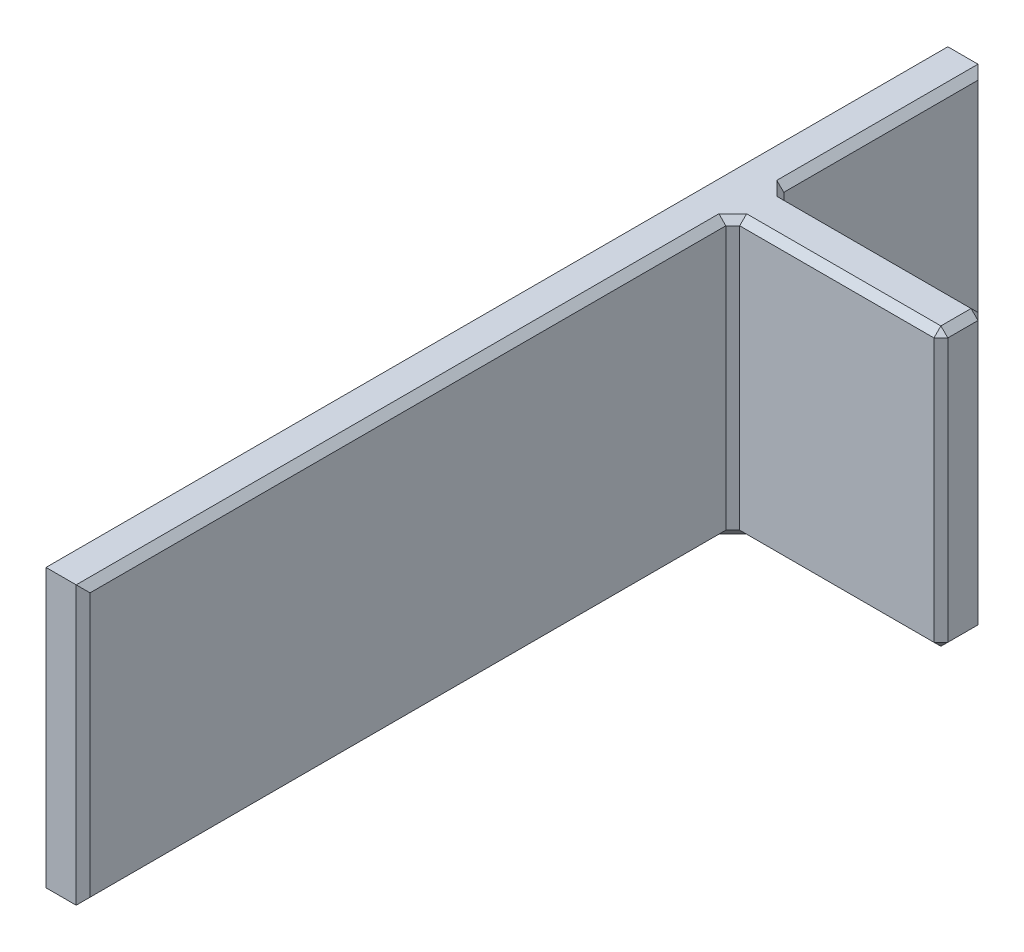
ISO-10303-21;
HEADER;
FILE_DESCRIPTION(('STEP AP214'),'2;1');
FILE_NAME('part.step','',(''),(''),'','','');
FILE_SCHEMA(('AUTOMOTIVE_DESIGN { 1 0 10303 214 1 1 1 1 }'));
ENDSEC;
DATA;
#1=APPLICATION_CONTEXT('core data for automotive mechanical design processes');
#2=APPLICATION_PROTOCOL_DEFINITION('international standard','automotive_design',2000,#1);
#3=PRODUCT_CONTEXT('',#1,'mechanical');
#4=PRODUCT('Part','Part','',(#3));
#5=PRODUCT_RELATED_PRODUCT_CATEGORY('part','',(#4));
#6=PRODUCT_DEFINITION_FORMATION('','',#4);
#7=PRODUCT_DEFINITION_CONTEXT('part definition',#1,'design');
#8=PRODUCT_DEFINITION('design','',#6,#7);
#9=PRODUCT_DEFINITION_SHAPE('','',#8);
#10=(LENGTH_UNIT() NAMED_UNIT(*) SI_UNIT(.MILLI.,.METRE.));
#11=(NAMED_UNIT(*) PLANE_ANGLE_UNIT() SI_UNIT($,.RADIAN.));
#12=(NAMED_UNIT(*) SI_UNIT($,.STERADIAN.) SOLID_ANGLE_UNIT());
#13=UNCERTAINTY_MEASURE_WITH_UNIT(LENGTH_MEASURE(1.E-05),#10,'distance_accuracy_value','');
#14=(GEOMETRIC_REPRESENTATION_CONTEXT(3) GLOBAL_UNCERTAINTY_ASSIGNED_CONTEXT((#13)) GLOBAL_UNIT_ASSIGNED_CONTEXT((#10,
#11,#12)) REPRESENTATION_CONTEXT('',''));
#15=CARTESIAN_POINT('',(0.,0.,0.));
#16=DIRECTION('',(0.,0.,1.));
#17=DIRECTION('',(1.,0.,0.));
#18=AXIS2_PLACEMENT_3D('',#15,#16,#17);
#19=CARTESIAN_POINT('',(3.175,-20.,130.));
#20=DIRECTION('',(0.,1.,0.));
#21=DIRECTION('',(0.,0.,1.));
#22=AXIS2_PLACEMENT_3D('',#19,#20,#21);
#23=PLANE('',#22);
#24=DIRECTION('',(1.,0.,0.));
#25=VECTOR('',#24,1.);
#26=CARTESIAN_POINT('',(3.175,-20.,0.));
#27=LINE('',#26,#25);
#28=CARTESIAN_POINT('',(-2.175,-20.,0.));
#29=VERTEX_POINT('',#28);
#30=CARTESIAN_POINT('',(2.17499999999999,-20.,0.));
#31=VERTEX_POINT('',#30);
#32=EDGE_CURVE('E425',#29,#31,#27,.T.);
#33=ORIENTED_EDGE('',*,*,#32,.T.);
#34=DIRECTION('',(0.,0.,1.));
#35=VECTOR('',#34,1.);
#36=CARTESIAN_POINT('',(2.17499999999999,-20.,130.));
#37=LINE('',#36,#35);
#38=CARTESIAN_POINT('',(2.17499999999999,-20.,29.));
#39=VERTEX_POINT('',#38);
#40=EDGE_CURVE('E247',#31,#39,#37,.T.);
#41=ORIENTED_EDGE('',*,*,#40,.T.);
#42=DIRECTION('',(-0.707106781186554,0.,-0.707106781186541));
#43=VECTOR('',#42,1.);
#44=CARTESIAN_POINT('',(2.17499999999999,-20.,29.));
#45=LINE('',#44,#43);
#46=CARTESIAN_POINT('',(3.175,-20.,30.));
#47=VERTEX_POINT('',#46);
#48=EDGE_CURVE('E243',#47,#39,#45,.T.);
#49=ORIENTED_EDGE('',*,*,#48,.F.);
#50=DIRECTION('',(-0.707106781186554,0.,-0.707106781186541));
#51=VECTOR('',#50,1.);
#52=CARTESIAN_POINT('',(2.17499999999999,-20.,29.));
#53=LINE('',#52,#51);
#54=CARTESIAN_POINT('',(4.17500000000002,-20.,31.));
#55=VERTEX_POINT('',#54);
#56=EDGE_CURVE('E239',#55,#47,#53,.T.);
#57=ORIENTED_EDGE('',*,*,#56,.F.);
#58=DIRECTION('',(1.,0.,0.));
#59=VECTOR('',#58,1.);
#60=CARTESIAN_POINT('',(3.175,-20.,31.));
#61=LINE('',#60,#59);
#62=CARTESIAN_POINT('',(32.175,-20.,31.));
#63=VERTEX_POINT('',#62);
#64=EDGE_CURVE('E236',#55,#63,#61,.T.);
#65=ORIENTED_EDGE('',*,*,#64,.T.);
#66=DIRECTION('',(0.,0.,1.));
#67=VECTOR('',#66,1.);
#68=CARTESIAN_POINT('',(32.175,-20.,130.));
#69=LINE('',#68,#67);
#70=CARTESIAN_POINT('',(32.175,-20.,35.35));
#71=VERTEX_POINT('',#70);
#72=EDGE_CURVE('E233',#63,#71,#69,.T.);
#73=ORIENTED_EDGE('',*,*,#72,.T.);
#74=DIRECTION('',(-1.,0.,0.));
#75=VECTOR('',#74,1.);
#76=CARTESIAN_POINT('',(3.175,-20.,35.35));
#77=LINE('',#76,#75);
#78=CARTESIAN_POINT('',(4.17500000000002,-20.,35.35));
#79=VERTEX_POINT('',#78);
#80=EDGE_CURVE('E212',#71,#79,#77,.T.);
#81=ORIENTED_EDGE('',*,*,#80,.T.);
#82=DIRECTION('',(0.707106781186553,0.,-0.707106781186542));
#83=VECTOR('',#82,1.);
#84=CARTESIAN_POINT('',(4.17500000000002,-20.,35.35));
#85=LINE('',#84,#83);
#86=CARTESIAN_POINT('',(3.175,-20.,36.35));
#87=VERTEX_POINT('',#86);
#88=EDGE_CURVE('E206',#87,#79,#85,.T.);
#89=ORIENTED_EDGE('',*,*,#88,.F.);
#90=DIRECTION('',(0.707106781186553,0.,-0.707106781186542));
#91=VECTOR('',#90,1.);
#92=CARTESIAN_POINT('',(4.17500000000002,-20.,35.35));
#93=LINE('',#92,#91);
#94=CARTESIAN_POINT('',(2.17499999999999,-20.,37.35));
#95=VERTEX_POINT('',#94);
#96=EDGE_CURVE('E209',#95,#87,#93,.T.);
#97=ORIENTED_EDGE('',*,*,#96,.F.);
#98=DIRECTION('',(0.,0.,1.));
#99=VECTOR('',#98,1.);
#100=CARTESIAN_POINT('',(2.17499999999999,-20.,130.));
#101=LINE('',#100,#99);
#102=CARTESIAN_POINT('',(2.17499999999999,-20.,130.));
#103=VERTEX_POINT('',#102);
#104=EDGE_CURVE('E224',#95,#103,#101,.T.);
#105=ORIENTED_EDGE('',*,*,#104,.T.);
#106=DIRECTION('',(1.,0.,0.));
#107=VECTOR('',#106,1.);
#108=CARTESIAN_POINT('',(3.175,-20.,130.));
#109=LINE('',#108,#107);
#110=CARTESIAN_POINT('',(-2.175,-20.,130.));
#111=VERTEX_POINT('',#110);
#112=EDGE_CURVE('E503',#111,#103,#109,.T.);
#113=ORIENTED_EDGE('',*,*,#112,.F.);
#114=DIRECTION('',(0.,0.,-1.));
#115=VECTOR('',#114,1.);
#116=CARTESIAN_POINT('',(-2.175,-20.,130.));
#117=LINE('',#116,#115);
#118=EDGE_CURVE('E227',#111,#29,#117,.T.);
#119=ORIENTED_EDGE('',*,*,#118,.T.);
#120=EDGE_LOOP('',(#33,#41,#49,#57,#65,#73,#81,#89,#97,#105,#113,#119));
#121=FACE_BOUND('',#120,.T.);
#122=ADVANCED_FACE('F44',(#121),#23,.F.);
#123=CARTESIAN_POINT('',(3.175,20.,130.));
#124=DIRECTION('',(0.,-1.,0.));
#125=DIRECTION('',(0.,0.,-1.));
#126=AXIS2_PLACEMENT_3D('',#123,#124,#125);
#127=PLANE('',#126);
#128=DIRECTION('',(0.707106781186554,0.,0.707106781186541));
#129=VECTOR('',#128,1.);
#130=CARTESIAN_POINT('',(4.17500000000001,20.,31.));
#131=LINE('',#130,#129);
#132=CARTESIAN_POINT('',(2.17499999999999,20.,29.));
#133=VERTEX_POINT('',#132);
#134=CARTESIAN_POINT('',(3.175,20.,30.));
#135=VERTEX_POINT('',#134);
#136=EDGE_CURVE('E466',#133,#135,#131,.T.);
#137=ORIENTED_EDGE('',*,*,#136,.F.);
#138=DIRECTION('',(0.,0.,-1.));
#139=VECTOR('',#138,1.);
#140=CARTESIAN_POINT('',(2.17499999999999,20.,130.));
#141=LINE('',#140,#139);
#142=CARTESIAN_POINT('',(2.17499999999999,20.,0.));
#143=VERTEX_POINT('',#142);
#144=EDGE_CURVE('E463',#133,#143,#141,.T.);
#145=ORIENTED_EDGE('',*,*,#144,.T.);
#146=DIRECTION('',(-1.,0.,0.));
#147=VECTOR('',#146,1.);
#148=CARTESIAN_POINT('',(3.175,20.,0.));
#149=LINE('',#148,#147);
#150=CARTESIAN_POINT('',(-2.175,20.,0.));
#151=VERTEX_POINT('',#150);
#152=EDGE_CURVE('E499',#143,#151,#149,.T.);
#153=ORIENTED_EDGE('',*,*,#152,.T.);
#154=DIRECTION('',(0.,0.,1.));
#155=VECTOR('',#154,1.);
#156=CARTESIAN_POINT('',(-2.175,20.,130.));
#157=LINE('',#156,#155);
#158=CARTESIAN_POINT('',(-2.175,20.,130.));
#159=VERTEX_POINT('',#158);
#160=EDGE_CURVE('E495',#151,#159,#157,.T.);
#161=ORIENTED_EDGE('',*,*,#160,.T.);
#162=DIRECTION('',(-1.,0.,0.));
#163=VECTOR('',#162,1.);
#164=CARTESIAN_POINT('',(3.175,20.,130.));
#165=LINE('',#164,#163);
#166=CARTESIAN_POINT('',(2.17499999999999,20.,130.));
#167=VERTEX_POINT('',#166);
#168=EDGE_CURVE('E498',#167,#159,#165,.T.);
#169=ORIENTED_EDGE('',*,*,#168,.F.);
#170=DIRECTION('',(0.,0.,-1.));
#171=VECTOR('',#170,1.);
#172=CARTESIAN_POINT('',(2.17499999999999,20.,130.));
#173=LINE('',#172,#171);
#174=CARTESIAN_POINT('',(2.17499999999999,20.,37.35));
#175=VERTEX_POINT('',#174);
#176=EDGE_CURVE('E484',#167,#175,#173,.T.);
#177=ORIENTED_EDGE('',*,*,#176,.T.);
#178=DIRECTION('',(-0.707106781186553,0.,0.707106781186542));
#179=VECTOR('',#178,1.);
#180=CARTESIAN_POINT('',(2.17499999999999,20.,37.35));
#181=LINE('',#180,#179);
#182=CARTESIAN_POINT('',(3.175,20.,36.35));
#183=VERTEX_POINT('',#182);
#184=EDGE_CURVE('E491',#183,#175,#181,.T.);
#185=ORIENTED_EDGE('',*,*,#184,.F.);
#186=DIRECTION('',(-0.707106781186553,0.,0.707106781186542));
#187=VECTOR('',#186,1.);
#188=CARTESIAN_POINT('',(2.17499999999999,20.,37.35));
#189=LINE('',#188,#187);
#190=CARTESIAN_POINT('',(4.17500000000002,20.,35.35));
#191=VERTEX_POINT('',#190);
#192=EDGE_CURVE('E487',#191,#183,#189,.T.);
#193=ORIENTED_EDGE('',*,*,#192,.F.);
#194=DIRECTION('',(1.,0.,0.));
#195=VECTOR('',#194,1.);
#196=CARTESIAN_POINT('',(3.175,20.,35.35));
#197=LINE('',#196,#195);
#198=CARTESIAN_POINT('',(32.175,20.,35.35));
#199=VERTEX_POINT('',#198);
#200=EDGE_CURVE('E481',#191,#199,#197,.T.);
#201=ORIENTED_EDGE('',*,*,#200,.T.);
#202=DIRECTION('',(0.,0.,-1.));
#203=VECTOR('',#202,1.);
#204=CARTESIAN_POINT('',(32.175,20.,130.));
#205=LINE('',#204,#203);
#206=CARTESIAN_POINT('',(32.175,20.,31.));
#207=VERTEX_POINT('',#206);
#208=EDGE_CURVE('E478',#199,#207,#205,.T.);
#209=ORIENTED_EDGE('',*,*,#208,.T.);
#210=DIRECTION('',(-1.,0.,0.));
#211=VECTOR('',#210,1.);
#212=CARTESIAN_POINT('',(3.175,20.,31.));
#213=LINE('',#212,#211);
#214=CARTESIAN_POINT('',(4.17500000000002,20.,31.));
#215=VERTEX_POINT('',#214);
#216=EDGE_CURVE('E474',#207,#215,#213,.T.);
#217=ORIENTED_EDGE('',*,*,#216,.T.);
#218=DIRECTION('',(0.707106781186554,0.,0.707106781186541));
#219=VECTOR('',#218,1.);
#220=CARTESIAN_POINT('',(4.17500000000001,20.,31.));
#221=LINE('',#220,#219);
#222=EDGE_CURVE('E470',#135,#215,#221,.T.);
#223=ORIENTED_EDGE('',*,*,#222,.F.);
#224=EDGE_LOOP('',(#137,#145,#153,#161,#169,#177,#185,#193,#201,#209,#217,#223));
#225=FACE_BOUND('',#224,.T.);
#226=ADVANCED_FACE('F529',(#225),#127,.F.);
#227=CARTESIAN_POINT('',(3.175,-20.,130.));
#228=DIRECTION('',(-1.,0.,0.));
#229=DIRECTION('',(0.,0.,1.));
#230=AXIS2_PLACEMENT_3D('',#227,#228,#229);
#231=PLANE('',#230);
#232=DIRECTION('',(0.,1.,0.));
#233=VECTOR('',#232,1.);
#234=CARTESIAN_POINT('',(3.175,-20.,1.));
#235=LINE('',#234,#233);
#236=CARTESIAN_POINT('',(3.175,-19.,1.));
#237=VERTEX_POINT('',#236);
#238=CARTESIAN_POINT('',(3.175,19.,1.));
#239=VERTEX_POINT('',#238);
#240=EDGE_CURVE('E256',#237,#239,#235,.T.);
#241=ORIENTED_EDGE('',*,*,#240,.T.);
#242=DIRECTION('',(0.,0.,1.));
#243=VECTOR('',#242,1.);
#244=CARTESIAN_POINT('',(3.175,19.,130.));
#245=LINE('',#244,#243);
#246=CARTESIAN_POINT('',(3.175,19.,29.));
#247=VERTEX_POINT('',#246);
#248=EDGE_CURVE('E259',#239,#247,#245,.T.);
#249=ORIENTED_EDGE('',*,*,#248,.T.);
#250=DIRECTION('',(0.,-1.,0.));
#251=VECTOR('',#250,1.);
#252=CARTESIAN_POINT('',(3.175,-20.,29.));
#253=LINE('',#252,#251);
#254=CARTESIAN_POINT('',(3.175,-19.,29.));
#255=VERTEX_POINT('',#254);
#256=EDGE_CURVE('E250',#247,#255,#253,.T.);
#257=ORIENTED_EDGE('',*,*,#256,.T.);
#258=DIRECTION('',(0.,0.,-1.));
#259=VECTOR('',#258,1.);
#260=CARTESIAN_POINT('',(3.175,-19.,130.));
#261=LINE('',#260,#259);
#262=EDGE_CURVE('E253',#255,#237,#261,.T.);
#263=ORIENTED_EDGE('',*,*,#262,.T.);
#264=EDGE_LOOP('',(#241,#249,#257,#263));
#265=FACE_BOUND('',#264,.T.);
#266=ADVANCED_FACE('F547',(#265),#231,.F.);
#267=DIRECTION('',(0.,-1.,0.));
#268=VECTOR('',#267,1.);
#269=CARTESIAN_POINT('',(3.175,-20.,129.));
#270=LINE('',#269,#268);
#271=CARTESIAN_POINT('',(3.175,19.,129.));
#272=VERTEX_POINT('',#271);
#273=CARTESIAN_POINT('',(3.175,-19.,129.));
#274=VERTEX_POINT('',#273);
#275=EDGE_CURVE('E301',#272,#274,#270,.T.);
#276=ORIENTED_EDGE('',*,*,#275,.T.);
#277=DIRECTION('',(0.,0.,-1.));
#278=VECTOR('',#277,1.);
#279=CARTESIAN_POINT('',(3.175,-19.,130.));
#280=LINE('',#279,#278);
#281=CARTESIAN_POINT('',(3.175,-19.,37.35));
#282=VERTEX_POINT('',#281);
#283=EDGE_CURVE('E304',#274,#282,#280,.T.);
#284=ORIENTED_EDGE('',*,*,#283,.T.);
#285=DIRECTION('',(0.,1.,0.));
#286=VECTOR('',#285,1.);
#287=CARTESIAN_POINT('',(3.175,20.,37.35));
#288=LINE('',#287,#286);
#289=CARTESIAN_POINT('',(3.175,19.,37.35));
#290=VERTEX_POINT('',#289);
#291=EDGE_CURVE('E295',#282,#290,#288,.T.);
#292=ORIENTED_EDGE('',*,*,#291,.T.);
#293=DIRECTION('',(0.,0.,1.));
#294=VECTOR('',#293,1.);
#295=CARTESIAN_POINT('',(3.175,19.,130.));
#296=LINE('',#295,#294);
#297=EDGE_CURVE('E298',#290,#272,#296,.T.);
#298=ORIENTED_EDGE('',*,*,#297,.T.);
#299=EDGE_LOOP('',(#276,#284,#292,#298));
#300=FACE_BOUND('',#299,.T.);
#301=ADVANCED_FACE('F539',(#300),#231,.F.);
#302=CARTESIAN_POINT('',(-3.175,-20.,130.));
#303=DIRECTION('',(1.,0.,0.));
#304=DIRECTION('',(0.,0.,-1.));
#305=AXIS2_PLACEMENT_3D('',#302,#303,#304);
#306=PLANE('',#305);
#307=DIRECTION('',(0.,1.,0.));
#308=VECTOR('',#307,1.);
#309=CARTESIAN_POINT('',(-3.175,20.,129.));
#310=LINE('',#309,#308);
#311=CARTESIAN_POINT('',(-3.175,-19.,129.));
#312=VERTEX_POINT('',#311);
#313=CARTESIAN_POINT('',(-3.175,19.,129.));
#314=VERTEX_POINT('',#313);
#315=EDGE_CURVE('E55',#312,#314,#310,.T.);
#316=ORIENTED_EDGE('',*,*,#315,.T.);
#317=DIRECTION('',(0.,0.,-1.));
#318=VECTOR('',#317,1.);
#319=CARTESIAN_POINT('',(-3.175,19.,130.));
#320=LINE('',#319,#318);
#321=CARTESIAN_POINT('',(-3.175,19.,1.));
#322=VERTEX_POINT('',#321);
#323=EDGE_CURVE('E11',#314,#322,#320,.T.);
#324=ORIENTED_EDGE('',*,*,#323,.T.);
#325=DIRECTION('',(0.,-1.,0.));
#326=VECTOR('',#325,1.);
#327=CARTESIAN_POINT('',(-3.175,-20.,1.));
#328=LINE('',#327,#326);
#329=CARTESIAN_POINT('',(-3.175,-19.,1.));
#330=VERTEX_POINT('',#329);
#331=EDGE_CURVE('E314',#322,#330,#328,.T.);
#332=ORIENTED_EDGE('',*,*,#331,.T.);
#333=DIRECTION('',(0.,0.,1.));
#334=VECTOR('',#333,1.);
#335=CARTESIAN_POINT('',(-3.175,-19.,130.));
#336=LINE('',#335,#334);
#337=EDGE_CURVE('E66',#330,#312,#336,.T.);
#338=ORIENTED_EDGE('',*,*,#337,.T.);
#339=EDGE_LOOP('',(#316,#324,#332,#338));
#340=FACE_BOUND('',#339,.T.);
#341=ADVANCED_FACE('F537',(#340),#306,.F.);
#342=CARTESIAN_POINT('',(0.,0.,130.));
#343=DIRECTION('',(0.,0.,1.));
#344=DIRECTION('',(1.,0.,0.));
#345=AXIS2_PLACEMENT_3D('',#342,#343,#344);
#346=PLANE('',#345);
#347=ORIENTED_EDGE('',*,*,#112,.T.);
#348=DIRECTION('',(0.,1.,0.));
#349=VECTOR('',#348,1.);
#350=CARTESIAN_POINT('',(2.17499999999999,20.,130.));
#351=LINE('',#350,#349);
#352=EDGE_CURVE('E311',#103,#167,#351,.T.);
#353=ORIENTED_EDGE('',*,*,#352,.T.);
#354=ORIENTED_EDGE('',*,*,#168,.T.);
#355=DIRECTION('',(0.,-1.,0.));
#356=VECTOR('',#355,1.);
#357=CARTESIAN_POINT('',(-2.175,-20.,130.));
#358=LINE('',#357,#356);
#359=EDGE_CURVE('E308',#159,#111,#358,.T.);
#360=ORIENTED_EDGE('',*,*,#359,.T.);
#361=EDGE_LOOP('',(#347,#353,#354,#360));
#362=FACE_BOUND('',#361,.T.);
#363=ADVANCED_FACE('F513',(#362),#346,.T.);
#364=CARTESIAN_POINT('',(0.,0.,0.));
#365=DIRECTION('',(0.,0.,1.));
#366=DIRECTION('',(1.,0.,0.));
#367=AXIS2_PLACEMENT_3D('',#364,#365,#366);
#368=PLANE('',#367);
#369=ORIENTED_EDGE('',*,*,#152,.F.);
#370=DIRECTION('',(0.,-1.,0.));
#371=VECTOR('',#370,1.);
#372=CARTESIAN_POINT('',(2.17499999999999,0.,0.));
#373=LINE('',#372,#371);
#374=EDGE_CURVE('E266',#143,#31,#373,.T.);
#375=ORIENTED_EDGE('',*,*,#374,.T.);
#376=ORIENTED_EDGE('',*,*,#32,.F.);
#377=DIRECTION('',(0.,1.,0.));
#378=VECTOR('',#377,1.);
#379=CARTESIAN_POINT('',(-2.175,0.,0.));
#380=LINE('',#379,#378);
#381=EDGE_CURVE('E263',#29,#151,#380,.T.);
#382=ORIENTED_EDGE('',*,*,#381,.T.);
#383=EDGE_LOOP('',(#369,#375,#376,#382));
#384=FACE_BOUND('',#383,.T.);
#385=ADVANCED_FACE('F545',(#384),#368,.F.);
#386=CARTESIAN_POINT('',(33.175,-20.,36.35));
#387=DIRECTION('',(0.,0.,-1.));
#388=DIRECTION('',(-1.,0.,0.));
#389=AXIS2_PLACEMENT_3D('',#386,#387,#388);
#390=PLANE('',#389);
#391=DIRECTION('',(1.,0.,0.));
#392=VECTOR('',#391,1.);
#393=CARTESIAN_POINT('',(33.175,-19.,36.35));
#394=LINE('',#393,#392);
#395=CARTESIAN_POINT('',(4.17500000000002,-19.,36.35));
#396=VERTEX_POINT('',#395);
#397=CARTESIAN_POINT('',(32.175,-19.,36.35));
#398=VERTEX_POINT('',#397);
#399=EDGE_CURVE('E288',#396,#398,#394,.T.);
#400=ORIENTED_EDGE('',*,*,#399,.T.);
#401=DIRECTION('',(0.,1.,0.));
#402=VECTOR('',#401,1.);
#403=CARTESIAN_POINT('',(32.175,-20.,36.35));
#404=LINE('',#403,#402);
#405=CARTESIAN_POINT('',(32.175,19.,36.35));
#406=VERTEX_POINT('',#405);
#407=EDGE_CURVE('E291',#398,#406,#404,.T.);
#408=ORIENTED_EDGE('',*,*,#407,.T.);
#409=DIRECTION('',(-1.,0.,0.));
#410=VECTOR('',#409,1.);
#411=CARTESIAN_POINT('',(33.175,19.,36.35));
#412=LINE('',#411,#410);
#413=CARTESIAN_POINT('',(4.17500000000002,19.,36.35));
#414=VERTEX_POINT('',#413);
#415=EDGE_CURVE('E285',#406,#414,#412,.T.);
#416=ORIENTED_EDGE('',*,*,#415,.T.);
#417=DIRECTION('',(0.,-1.,0.));
#418=VECTOR('',#417,1.);
#419=CARTESIAN_POINT('',(4.17500000000002,-20.,36.35));
#420=LINE('',#419,#418);
#421=EDGE_CURVE('E282',#414,#396,#420,.T.);
#422=ORIENTED_EDGE('',*,*,#421,.T.);
#423=EDGE_LOOP('',(#400,#408,#416,#422));
#424=FACE_BOUND('',#423,.T.);
#425=ADVANCED_FACE('F561',(#424),#390,.F.);
#426=CARTESIAN_POINT('',(33.175,20.,30.));
#427=DIRECTION('',(0.,0.,1.));
#428=DIRECTION('',(0.,-1.,0.));
#429=AXIS2_PLACEMENT_3D('',#426,#427,#428);
#430=PLANE('',#429);
#431=DIRECTION('',(-1.,0.,0.));
#432=VECTOR('',#431,1.);
#433=CARTESIAN_POINT('',(33.175,-19.,30.));
#434=LINE('',#433,#432);
#435=CARTESIAN_POINT('',(32.175,-19.,30.));
#436=VERTEX_POINT('',#435);
#437=CARTESIAN_POINT('',(4.17500000000002,-19.,30.));
#438=VERTEX_POINT('',#437);
#439=EDGE_CURVE('E457',#436,#438,#434,.T.);
#440=ORIENTED_EDGE('',*,*,#439,.T.);
#441=DIRECTION('',(0.,1.,0.));
#442=VECTOR('',#441,1.);
#443=CARTESIAN_POINT('',(4.17500000000002,20.,30.));
#444=LINE('',#443,#442);
#445=CARTESIAN_POINT('',(4.17500000000002,19.,30.));
#446=VERTEX_POINT('',#445);
#447=EDGE_CURVE('E449',#438,#446,#444,.T.);
#448=ORIENTED_EDGE('',*,*,#447,.T.);
#449=DIRECTION('',(1.,0.,0.));
#450=VECTOR('',#449,1.);
#451=CARTESIAN_POINT('',(33.175,19.,30.));
#452=LINE('',#451,#450);
#453=CARTESIAN_POINT('',(32.175,19.,30.));
#454=VERTEX_POINT('',#453);
#455=EDGE_CURVE('E451',#446,#454,#452,.T.);
#456=ORIENTED_EDGE('',*,*,#455,.T.);
#457=DIRECTION('',(0.,-1.,0.));
#458=VECTOR('',#457,1.);
#459=CARTESIAN_POINT('',(32.175,20.,30.));
#460=LINE('',#459,#458);
#461=EDGE_CURVE('E460',#454,#436,#460,.T.);
#462=ORIENTED_EDGE('',*,*,#461,.T.);
#463=EDGE_LOOP('',(#440,#448,#456,#462));
#464=FACE_BOUND('',#463,.T.);
#465=ADVANCED_FACE('F566',(#464),#430,.F.);
#466=CARTESIAN_POINT('',(33.175,0.,0.));
#467=DIRECTION('',(-1.,0.,0.));
#468=DIRECTION('',(0.,0.,1.));
#469=AXIS2_PLACEMENT_3D('',#466,#467,#468);
#470=PLANE('',#469);
#471=DIRECTION('',(0.,0.,-1.));
#472=VECTOR('',#471,1.);
#473=CARTESIAN_POINT('',(33.175,-19.,0.));
#474=LINE('',#473,#472);
#475=CARTESIAN_POINT('',(33.175,-19.,35.35));
#476=VERTEX_POINT('',#475);
#477=CARTESIAN_POINT('',(33.175,-19.,31.));
#478=VERTEX_POINT('',#477);
#479=EDGE_CURVE('E275',#476,#478,#474,.T.);
#480=ORIENTED_EDGE('',*,*,#479,.T.);
#481=DIRECTION('',(0.,1.,0.));
#482=VECTOR('',#481,1.);
#483=CARTESIAN_POINT('',(33.175,0.,31.));
#484=LINE('',#483,#482);
#485=CARTESIAN_POINT('',(33.175,19.,31.));
#486=VERTEX_POINT('',#485);
#487=EDGE_CURVE('E278',#478,#486,#484,.T.);
#488=ORIENTED_EDGE('',*,*,#487,.T.);
#489=DIRECTION('',(0.,0.,1.));
#490=VECTOR('',#489,1.);
#491=CARTESIAN_POINT('',(33.175,19.,0.));
#492=LINE('',#491,#490);
#493=CARTESIAN_POINT('',(33.175,19.,35.35));
#494=VERTEX_POINT('',#493);
#495=EDGE_CURVE('E269',#486,#494,#492,.T.);
#496=ORIENTED_EDGE('',*,*,#495,.T.);
#497=DIRECTION('',(0.,-1.,0.));
#498=VECTOR('',#497,1.);
#499=CARTESIAN_POINT('',(33.175,0.,35.35));
#500=LINE('',#499,#498);
#501=EDGE_CURVE('E272',#494,#476,#500,.T.);
#502=ORIENTED_EDGE('',*,*,#501,.T.);
#503=EDGE_LOOP('',(#480,#488,#496,#502));
#504=FACE_BOUND('',#503,.T.);
#505=ADVANCED_FACE('F570',(#504),#470,.F.);
#506=CARTESIAN_POINT('',(3.175,-19.,130.));
#507=DIRECTION('',(-0.707106781186542,0.707106781186552,0.));
#508=DIRECTION('',(0.,0.,-1.));
#509=AXIS2_PLACEMENT_3D('',#506,#507,#508);
#510=PLANE('',#509);
#511=DIRECTION('',(-0.577350269189631,-0.577350269189623,0.577350269189623));
#512=VECTOR('',#511,1.);
#513=CARTESIAN_POINT('',(8.84166666666668,-13.3333333333334,123.333333333333));
#514=LINE('',#513,#512);
#515=EDGE_CURVE('E419',#103,#274,#514,.F.);
#516=ORIENTED_EDGE('',*,*,#515,.F.);
#517=ORIENTED_EDGE('',*,*,#104,.F.);
#518=DIRECTION('',(-0.707106781186552,-0.707106781186542,0.));
#519=VECTOR('',#518,1.);
#520=CARTESIAN_POINT('',(3.175,-19.,37.35));
#521=LINE('',#520,#519);
#522=EDGE_CURVE('E222',#282,#95,#521,.T.);
#523=ORIENTED_EDGE('',*,*,#522,.F.);
#524=ORIENTED_EDGE('',*,*,#283,.F.);
#525=EDGE_LOOP('',(#516,#517,#523,#524));
#526=FACE_BOUND('',#525,.T.);
#527=ADVANCED_FACE('F518',(#526),#510,.F.);
#528=CARTESIAN_POINT('',(4.17500000000002,-19.,36.35));
#529=DIRECTION('',(0.577350269189617,-0.577350269189634,0.577350269189626));
#530=DIRECTION('',(0.,-0.707106781186543,-0.707106781186552));
#531=AXIS2_PLACEMENT_3D('',#528,#529,#530);
#532=PLANE('',#531);
#533=ORIENTED_EDGE('',*,*,#96,.T.);
#534=ORIENTED_EDGE('',*,*,#88,.T.);
#535=DIRECTION('',(0.,0.707106781186542,0.707106781186552));
#536=VECTOR('',#535,1.);
#537=CARTESIAN_POINT('',(4.17500000000002,-20.,35.35));
#538=LINE('',#537,#536);
#539=EDGE_CURVE('E416',#396,#79,#538,.F.);
#540=ORIENTED_EDGE('',*,*,#539,.F.);
#541=DIRECTION('',(0.707106781186553,0.,-0.707106781186542));
#542=VECTOR('',#541,1.);
#543=CARTESIAN_POINT('',(4.17500000000002,-19.,36.35));
#544=LINE('',#543,#542);
#545=EDGE_CURVE('E412',#282,#396,#544,.T.);
#546=ORIENTED_EDGE('',*,*,#545,.F.);
#547=ORIENTED_EDGE('',*,*,#522,.T.);
#548=EDGE_LOOP('',(#533,#534,#540,#546,#547));
#549=FACE_BOUND('',#548,.T.);
#550=ADVANCED_FACE('F219',(#549),#532,.T.);
#551=CARTESIAN_POINT('',(2.17499999999999,0.,130.));
#552=DIRECTION('',(0.707106781186542,0.,0.707106781186552));
#553=DIRECTION('',(0.,-1.,0.));
#554=AXIS2_PLACEMENT_3D('',#551,#552,#553);
#555=PLANE('',#554);
#556=ORIENTED_EDGE('',*,*,#515,.T.);
#557=ORIENTED_EDGE('',*,*,#275,.F.);
#558=DIRECTION('',(-0.577350269189631,0.577350269189623,0.577350269189623));
#559=VECTOR('',#558,1.);
#560=CARTESIAN_POINT('',(2.17499999999999,20.,130.));
#561=LINE('',#560,#559);
#562=EDGE_CURVE('E408',#167,#272,#561,.F.);
#563=ORIENTED_EDGE('',*,*,#562,.F.);
#564=ORIENTED_EDGE('',*,*,#352,.F.);
#565=EDGE_LOOP('',(#556,#557,#563,#564));
#566=FACE_BOUND('',#565,.T.);
#567=ADVANCED_FACE('F522',(#566),#555,.T.);
#568=CARTESIAN_POINT('',(3.175,-20.,35.35));
#569=DIRECTION('',(0.,0.707106781186552,-0.707106781186542));
#570=DIRECTION('',(-1.,0.,0.));
#571=AXIS2_PLACEMENT_3D('',#568,#569,#570);
#572=PLANE('',#571);
#573=ORIENTED_EDGE('',*,*,#539,.T.);
#574=ORIENTED_EDGE('',*,*,#80,.F.);
#575=DIRECTION('',(0.,0.707106781186543,0.707106781186552));
#576=VECTOR('',#575,1.);
#577=CARTESIAN_POINT('',(32.175,-20.,35.35));
#578=LINE('',#577,#576);
#579=EDGE_CURVE('E404',#398,#71,#578,.F.);
#580=ORIENTED_EDGE('',*,*,#579,.F.);
#581=ORIENTED_EDGE('',*,*,#399,.F.);
#582=EDGE_LOOP('',(#573,#574,#580,#581));
#583=FACE_BOUND('',#582,.T.);
#584=ADVANCED_FACE('F620',(#583),#572,.F.);
#585=CARTESIAN_POINT('',(4.17500000000002,-20.,36.35));
#586=DIRECTION('',(0.707106781186542,0.,0.707106781186553));
#587=DIRECTION('',(0.,1.,0.));
#588=AXIS2_PLACEMENT_3D('',#585,#586,#587);
#589=PLANE('',#588);
#590=ORIENTED_EDGE('',*,*,#545,.T.);
#591=ORIENTED_EDGE('',*,*,#421,.F.);
#592=DIRECTION('',(-0.707106781186553,0.,0.707106781186542));
#593=VECTOR('',#592,1.);
#594=CARTESIAN_POINT('',(3.175,19.,37.35));
#595=LINE('',#594,#593);
#596=EDGE_CURVE('E400',#290,#414,#595,.F.);
#597=ORIENTED_EDGE('',*,*,#596,.F.);
#598=ORIENTED_EDGE('',*,*,#291,.F.);
#599=EDGE_LOOP('',(#590,#591,#597,#598));
#600=FACE_BOUND('',#599,.T.);
#601=ADVANCED_FACE('F632',(#600),#589,.T.);
#602=CARTESIAN_POINT('',(2.17499999999999,20.,130.));
#603=DIRECTION('',(-0.707106781186542,-0.707106781186552,0.));
#604=DIRECTION('',(0.,0.,-1.));
#605=AXIS2_PLACEMENT_3D('',#602,#603,#604);
#606=PLANE('',#605);
#607=ORIENTED_EDGE('',*,*,#562,.T.);
#608=ORIENTED_EDGE('',*,*,#297,.F.);
#609=DIRECTION('',(0.707106781186552,-0.707106781186542,0.));
#610=VECTOR('',#609,1.);
#611=CARTESIAN_POINT('',(2.17499999999999,20.,37.35));
#612=LINE('',#611,#610);
#613=EDGE_CURVE('E396',#175,#290,#612,.T.);
#614=ORIENTED_EDGE('',*,*,#613,.F.);
#615=ORIENTED_EDGE('',*,*,#176,.F.);
#616=EDGE_LOOP('',(#607,#608,#614,#615));
#617=FACE_BOUND('',#616,.T.);
#618=ADVANCED_FACE('F527',(#617),#606,.F.);
#619=CARTESIAN_POINT('',(32.175,-20.,35.35));
#620=DIRECTION('',(0.577350269189628,-0.577350269189628,0.57735026918962));
#621=DIRECTION('',(0.707106781186548,0.707106781186548,0.));
#622=AXIS2_PLACEMENT_3D('',#619,#620,#621);
#623=PLANE('',#622);
#624=DIRECTION('',(0.707106781186547,0.,-0.707106781186547));
#625=VECTOR('',#624,1.);
#626=CARTESIAN_POINT('',(32.675,-19.,35.85));
#627=LINE('',#626,#625);
#628=EDGE_CURVE('E388',#398,#476,#627,.T.);
#629=ORIENTED_EDGE('',*,*,#628,.F.);
#630=ORIENTED_EDGE('',*,*,#579,.T.);
#631=DIRECTION('',(-0.707106781186547,-0.707106781186547,0.));
#632=VECTOR('',#631,1.);
#633=CARTESIAN_POINT('',(32.175,-20.,35.35));
#634=LINE('',#633,#632);
#635=EDGE_CURVE('E392',#476,#71,#634,.T.);
#636=ORIENTED_EDGE('',*,*,#635,.F.);
#637=EDGE_LOOP('',(#629,#630,#636));
#638=FACE_BOUND('',#637,.T.);
#639=ADVANCED_FACE('F622',(#638),#623,.T.);
#640=CARTESIAN_POINT('',(3.175,19.,37.35));
#641=DIRECTION('',(0.57735026918962,0.577350269189628,0.577350269189629));
#642=DIRECTION('',(0.,-0.707106781186548,0.707106781186547));
#643=AXIS2_PLACEMENT_3D('',#640,#641,#642);
#644=PLANE('',#643);
#645=ORIENTED_EDGE('',*,*,#613,.T.);
#646=ORIENTED_EDGE('',*,*,#596,.T.);
#647=DIRECTION('',(0.,0.707106781186542,-0.707106781186552));
#648=VECTOR('',#647,1.);
#649=CARTESIAN_POINT('',(4.17500000000002,19.,36.35));
#650=LINE('',#649,#648);
#651=EDGE_CURVE('E384',#191,#414,#650,.F.);
#652=ORIENTED_EDGE('',*,*,#651,.F.);
#653=ORIENTED_EDGE('',*,*,#192,.T.);
#654=ORIENTED_EDGE('',*,*,#184,.T.);
#655=EDGE_LOOP('',(#645,#646,#652,#653,#654));
#656=FACE_BOUND('',#655,.T.);
#657=ADVANCED_FACE('F624',(#656),#644,.T.);
#658=CARTESIAN_POINT('',(33.175,-19.,0.));
#659=DIRECTION('',(-0.707106781186547,0.707106781186547,0.));
#660=DIRECTION('',(0.,0.,-1.));
#661=AXIS2_PLACEMENT_3D('',#658,#659,#660);
#662=PLANE('',#661);
#663=ORIENTED_EDGE('',*,*,#635,.T.);
#664=ORIENTED_EDGE('',*,*,#72,.F.);
#665=DIRECTION('',(0.707106781186547,0.707106781186547,0.));
#666=VECTOR('',#665,1.);
#667=CARTESIAN_POINT('',(32.175,-20.,31.));
#668=LINE('',#667,#666);
#669=EDGE_CURVE('E376',#478,#63,#668,.F.);
#670=ORIENTED_EDGE('',*,*,#669,.F.);
#671=ORIENTED_EDGE('',*,*,#479,.F.);
#672=EDGE_LOOP('',(#663,#664,#670,#671));
#673=FACE_BOUND('',#672,.T.);
#674=ADVANCED_FACE('F586',(#673),#662,.F.);
#675=CARTESIAN_POINT('',(33.175,0.,35.35));
#676=DIRECTION('',(-0.707106781186547,0.,-0.707106781186547));
#677=DIRECTION('',(0.,-1.,0.));
#678=AXIS2_PLACEMENT_3D('',#675,#676,#677);
#679=PLANE('',#678);
#680=ORIENTED_EDGE('',*,*,#628,.T.);
#681=ORIENTED_EDGE('',*,*,#501,.F.);
#682=DIRECTION('',(-0.707106781186547,0.,0.707106781186547));
#683=VECTOR('',#682,1.);
#684=CARTESIAN_POINT('',(32.175,19.,36.35));
#685=LINE('',#684,#683);
#686=EDGE_CURVE('E372',#406,#494,#685,.F.);
#687=ORIENTED_EDGE('',*,*,#686,.F.);
#688=ORIENTED_EDGE('',*,*,#407,.F.);
#689=EDGE_LOOP('',(#680,#681,#687,#688));
#690=FACE_BOUND('',#689,.T.);
#691=ADVANCED_FACE('F604',(#690),#679,.F.);
#692=CARTESIAN_POINT('',(33.175,19.,36.35));
#693=DIRECTION('',(0.,-0.707106781186552,-0.707106781186542));
#694=DIRECTION('',(-1.,0.,0.));
#695=AXIS2_PLACEMENT_3D('',#692,#693,#694);
#696=PLANE('',#695);
#697=ORIENTED_EDGE('',*,*,#651,.T.);
#698=ORIENTED_EDGE('',*,*,#415,.F.);
#699=DIRECTION('',(0.,0.707106781186543,-0.707106781186552));
#700=VECTOR('',#699,1.);
#701=CARTESIAN_POINT('',(32.175,19.,36.35));
#702=LINE('',#701,#700);
#703=EDGE_CURVE('E369',#199,#406,#702,.F.);
#704=ORIENTED_EDGE('',*,*,#703,.F.);
#705=ORIENTED_EDGE('',*,*,#200,.F.);
#706=EDGE_LOOP('',(#697,#698,#704,#705));
#707=FACE_BOUND('',#706,.T.);
#708=ADVANCED_FACE('F614',(#707),#696,.F.);
#709=CARTESIAN_POINT('',(3.175,-19.,130.));
#710=DIRECTION('',(-0.707106781186542,0.707106781186552,0.));
#711=DIRECTION('',(0.,0.,-1.));
#712=AXIS2_PLACEMENT_3D('',#709,#710,#711);
#713=PLANE('',#712);
#714=DIRECTION('',(0.707106781186552,0.707106781186542,0.));
#715=VECTOR('',#714,1.);
#716=CARTESIAN_POINT('',(2.17499999999999,-20.,29.));
#717=LINE('',#716,#715);
#718=EDGE_CURVE('E361',#39,#255,#717,.T.);
#719=ORIENTED_EDGE('',*,*,#718,.F.);
#720=ORIENTED_EDGE('',*,*,#40,.F.);
#721=DIRECTION('',(0.577350269189631,0.577350269189623,0.577350269189623));
#722=VECTOR('',#721,1.);
#723=CARTESIAN_POINT('',(46.1750000000002,23.9999999999996,43.9999999999996));
#724=LINE('',#723,#722);
#725=EDGE_CURVE('E365',#237,#31,#724,.F.);
#726=ORIENTED_EDGE('',*,*,#725,.F.);
#727=ORIENTED_EDGE('',*,*,#262,.F.);
#728=EDGE_LOOP('',(#719,#720,#726,#727));
#729=FACE_BOUND('',#728,.T.);
#730=ADVANCED_FACE('F762',(#729),#713,.F.);
#731=CARTESIAN_POINT('',(33.175,-19.,30.));
#732=DIRECTION('',(0.,0.707106781186554,0.707106781186541));
#733=DIRECTION('',(-1.,0.,0.));
#734=AXIS2_PLACEMENT_3D('',#731,#732,#733);
#735=PLANE('',#734);
#736=DIRECTION('',(0.,-0.707106781186541,0.707106781186554));
#737=VECTOR('',#736,1.);
#738=CARTESIAN_POINT('',(32.175,-20.,31.));
#739=LINE('',#738,#737);
#740=EDGE_CURVE('E380',#63,#436,#739,.F.);
#741=ORIENTED_EDGE('',*,*,#740,.F.);
#742=ORIENTED_EDGE('',*,*,#64,.F.);
#743=DIRECTION('',(0.,-0.707106781186541,0.707106781186554));
#744=VECTOR('',#743,1.);
#745=CARTESIAN_POINT('',(4.17500000000002,-19.,30.));
#746=LINE('',#745,#744);
#747=EDGE_CURVE('E357',#438,#55,#746,.T.);
#748=ORIENTED_EDGE('',*,*,#747,.F.);
#749=ORIENTED_EDGE('',*,*,#439,.F.);
#750=EDGE_LOOP('',(#741,#742,#748,#749));
#751=FACE_BOUND('',#750,.T.);
#752=ADVANCED_FACE('F756',(#751),#735,.F.);
#753=CARTESIAN_POINT('',(32.175,-20.,31.));
#754=DIRECTION('',(0.577350269189628,-0.57735026918963,-0.57735026918962));
#755=DIRECTION('',(0.707106781186549,0.707106781186546,0.));
#756=AXIS2_PLACEMENT_3D('',#753,#754,#755);
#757=PLANE('',#756);
#758=ORIENTED_EDGE('',*,*,#669,.T.);
#759=ORIENTED_EDGE('',*,*,#740,.T.);
#760=DIRECTION('',(-0.707106781186547,0.,-0.707106781186548));
#761=VECTOR('',#760,1.);
#762=CARTESIAN_POINT('',(32.675,-19.,30.5));
#763=LINE('',#762,#761);
#764=EDGE_CURVE('E353',#478,#436,#763,.T.);
#765=ORIENTED_EDGE('',*,*,#764,.F.);
#766=EDGE_LOOP('',(#758,#759,#765));
#767=FACE_BOUND('',#766,.T.);
#768=ADVANCED_FACE('F589',(#767),#757,.T.);
#769=CARTESIAN_POINT('',(32.175,19.,36.35));
#770=DIRECTION('',(0.577350269189628,0.577350269189628,0.57735026918962));
#771=DIRECTION('',(-0.707106781186548,0.707106781186548,0.));
#772=AXIS2_PLACEMENT_3D('',#769,#770,#771);
#773=PLANE('',#772);
#774=ORIENTED_EDGE('',*,*,#703,.T.);
#775=ORIENTED_EDGE('',*,*,#686,.T.);
#776=DIRECTION('',(0.707106781186547,-0.707106781186547,0.));
#777=VECTOR('',#776,1.);
#778=CARTESIAN_POINT('',(32.675,19.5,35.35));
#779=LINE('',#778,#777);
#780=EDGE_CURVE('E349',#199,#494,#779,.T.);
#781=ORIENTED_EDGE('',*,*,#780,.F.);
#782=EDGE_LOOP('',(#774,#775,#781));
#783=FACE_BOUND('',#782,.T.);
#784=ADVANCED_FACE('F610',(#783),#773,.T.);
#785=CARTESIAN_POINT('',(3.175,-20.,1.));
#786=DIRECTION('',(-0.707106781186542,0.,0.707106781186552));
#787=DIRECTION('',(0.,1.,0.));
#788=AXIS2_PLACEMENT_3D('',#785,#786,#787);
#789=PLANE('',#788);
#790=ORIENTED_EDGE('',*,*,#725,.T.);
#791=ORIENTED_EDGE('',*,*,#374,.F.);
#792=DIRECTION('',(0.577350269189631,-0.577350269189623,0.577350269189623));
#793=VECTOR('',#792,1.);
#794=CARTESIAN_POINT('',(16.1750000000001,6.00000000000012,13.9999999999999));
#795=LINE('',#794,#793);
#796=EDGE_CURVE('E345',#239,#143,#795,.F.);
#797=ORIENTED_EDGE('',*,*,#796,.F.);
#798=ORIENTED_EDGE('',*,*,#240,.F.);
#799=EDGE_LOOP('',(#790,#791,#797,#798));
#800=FACE_BOUND('',#799,.T.);
#801=ADVANCED_FACE('F738',(#800),#789,.F.);
#802=CARTESIAN_POINT('',(3.175,-19.,29.));
#803=DIRECTION('',(0.57735026918962,-0.577350269189628,-0.57735026918963));
#804=DIRECTION('',(0.,0.707106781186549,-0.707106781186546));
#805=AXIS2_PLACEMENT_3D('',#802,#803,#804);
#806=PLANE('',#805);
#807=ORIENTED_EDGE('',*,*,#48,.T.);
#808=ORIENTED_EDGE('',*,*,#718,.T.);
#809=DIRECTION('',(-0.707106781186554,0.,-0.707106781186541));
#810=VECTOR('',#809,1.);
#811=CARTESIAN_POINT('',(3.175,-19.,29.));
#812=LINE('',#811,#810);
#813=EDGE_CURVE('E341',#438,#255,#812,.T.);
#814=ORIENTED_EDGE('',*,*,#813,.F.);
#815=ORIENTED_EDGE('',*,*,#747,.T.);
#816=ORIENTED_EDGE('',*,*,#56,.T.);
#817=EDGE_LOOP('',(#807,#808,#814,#815,#816));
#818=FACE_BOUND('',#817,.T.);
#819=ADVANCED_FACE('F732',(#818),#806,.T.);
#820=CARTESIAN_POINT('',(33.175,0.,31.));
#821=DIRECTION('',(-0.707106781186548,0.,0.707106781186547));
#822=DIRECTION('',(0.,1.,0.));
#823=AXIS2_PLACEMENT_3D('',#820,#821,#822);
#824=PLANE('',#823);
#825=ORIENTED_EDGE('',*,*,#764,.T.);
#826=ORIENTED_EDGE('',*,*,#461,.F.);
#827=DIRECTION('',(0.707106781186547,0.,0.707106781186548));
#828=VECTOR('',#827,1.);
#829=CARTESIAN_POINT('',(32.175,19.,30.));
#830=LINE('',#829,#828);
#831=EDGE_CURVE('E337',#486,#454,#830,.F.);
#832=ORIENTED_EDGE('',*,*,#831,.F.);
#833=ORIENTED_EDGE('',*,*,#487,.F.);
#834=EDGE_LOOP('',(#825,#826,#832,#833));
#835=FACE_BOUND('',#834,.T.);
#836=ADVANCED_FACE('F593',(#835),#824,.F.);
#837=CARTESIAN_POINT('',(33.175,19.,0.));
#838=DIRECTION('',(-0.707106781186547,-0.707106781186547,0.));
#839=DIRECTION('',(0.,0.,1.));
#840=AXIS2_PLACEMENT_3D('',#837,#838,#839);
#841=PLANE('',#840);
#842=ORIENTED_EDGE('',*,*,#780,.T.);
#843=ORIENTED_EDGE('',*,*,#495,.F.);
#844=DIRECTION('',(-0.707106781186547,0.707106781186547,0.));
#845=VECTOR('',#844,1.);
#846=CARTESIAN_POINT('',(32.675,19.5,31.));
#847=LINE('',#846,#845);
#848=EDGE_CURVE('E334',#207,#486,#847,.F.);
#849=ORIENTED_EDGE('',*,*,#848,.F.);
#850=ORIENTED_EDGE('',*,*,#208,.F.);
#851=EDGE_LOOP('',(#842,#843,#849,#850));
#852=FACE_BOUND('',#851,.T.);
#853=ADVANCED_FACE('F599',(#852),#841,.F.);
#854=CARTESIAN_POINT('',(2.17499999999999,20.,130.));
#855=DIRECTION('',(-0.707106781186542,-0.707106781186552,0.));
#856=DIRECTION('',(0.,0.,-1.));
#857=AXIS2_PLACEMENT_3D('',#854,#855,#856);
#858=PLANE('',#857);
#859=ORIENTED_EDGE('',*,*,#796,.T.);
#860=ORIENTED_EDGE('',*,*,#144,.F.);
#861=DIRECTION('',(-0.707106781186552,0.707106781186542,0.));
#862=VECTOR('',#861,1.);
#863=CARTESIAN_POINT('',(3.175,19.,29.));
#864=LINE('',#863,#862);
#865=EDGE_CURVE('E330',#247,#133,#864,.T.);
#866=ORIENTED_EDGE('',*,*,#865,.F.);
#867=ORIENTED_EDGE('',*,*,#248,.F.);
#868=EDGE_LOOP('',(#859,#860,#866,#867));
#869=FACE_BOUND('',#868,.T.);
#870=ADVANCED_FACE('F714',(#869),#858,.F.);
#871=CARTESIAN_POINT('',(4.17500000000002,20.,30.));
#872=DIRECTION('',(0.707106781186541,0.,-0.707106781186554));
#873=DIRECTION('',(0.,-1.,0.));
#874=AXIS2_PLACEMENT_3D('',#871,#872,#873);
#875=PLANE('',#874);
#876=ORIENTED_EDGE('',*,*,#813,.T.);
#877=ORIENTED_EDGE('',*,*,#256,.F.);
#878=DIRECTION('',(0.707106781186554,0.,0.707106781186541));
#879=VECTOR('',#878,1.);
#880=CARTESIAN_POINT('',(4.17500000000002,19.,30.));
#881=LINE('',#880,#879);
#882=EDGE_CURVE('E327',#446,#247,#881,.F.);
#883=ORIENTED_EDGE('',*,*,#882,.F.);
#884=ORIENTED_EDGE('',*,*,#447,.F.);
#885=EDGE_LOOP('',(#876,#877,#883,#884));
#886=FACE_BOUND('',#885,.T.);
#887=ADVANCED_FACE('F708',(#886),#875,.T.);
#888=CARTESIAN_POINT('',(32.175,19.,30.));
#889=DIRECTION('',(0.577350269189628,0.577350269189628,-0.57735026918962));
#890=DIRECTION('',(-0.707106781186548,0.707106781186548,0.));
#891=AXIS2_PLACEMENT_3D('',#888,#889,#890);
#892=PLANE('',#891);
#893=ORIENTED_EDGE('',*,*,#848,.T.);
#894=ORIENTED_EDGE('',*,*,#831,.T.);
#895=DIRECTION('',(0.,-0.707106781186543,-0.707106781186552));
#896=VECTOR('',#895,1.);
#897=CARTESIAN_POINT('',(32.175,19.,30.));
#898=LINE('',#897,#896);
#899=EDGE_CURVE('E324',#207,#454,#898,.T.);
#900=ORIENTED_EDGE('',*,*,#899,.F.);
#901=EDGE_LOOP('',(#893,#894,#900));
#902=FACE_BOUND('',#901,.T.);
#903=ADVANCED_FACE('F692',(#902),#892,.T.);
#904=CARTESIAN_POINT('',(4.17500000000002,19.,30.));
#905=DIRECTION('',(0.577350269189616,0.577350269189635,-0.577350269189627));
#906=DIRECTION('',(0.,0.707106781186543,0.707106781186553));
#907=AXIS2_PLACEMENT_3D('',#904,#905,#906);
#908=PLANE('',#907);
#909=ORIENTED_EDGE('',*,*,#136,.T.);
#910=ORIENTED_EDGE('',*,*,#222,.T.);
#911=DIRECTION('',(0.,-0.707106781186542,-0.707106781186552));
#912=VECTOR('',#911,1.);
#913=CARTESIAN_POINT('',(4.17500000000002,20.,31.));
#914=LINE('',#913,#912);
#915=EDGE_CURVE('E321',#446,#215,#914,.F.);
#916=ORIENTED_EDGE('',*,*,#915,.F.);
#917=ORIENTED_EDGE('',*,*,#882,.T.);
#918=ORIENTED_EDGE('',*,*,#865,.T.);
#919=EDGE_LOOP('',(#909,#910,#916,#917,#918));
#920=FACE_BOUND('',#919,.T.);
#921=ADVANCED_FACE('F687',(#920),#908,.T.);
#922=CARTESIAN_POINT('',(3.175,20.,31.));
#923=DIRECTION('',(0.,-0.707106781186552,0.707106781186542));
#924=DIRECTION('',(-1.,0.,0.));
#925=AXIS2_PLACEMENT_3D('',#922,#923,#924);
#926=PLANE('',#925);
#927=ORIENTED_EDGE('',*,*,#899,.T.);
#928=ORIENTED_EDGE('',*,*,#455,.F.);
#929=ORIENTED_EDGE('',*,*,#915,.T.);
#930=ORIENTED_EDGE('',*,*,#216,.F.);
#931=EDGE_LOOP('',(#927,#928,#929,#930));
#932=FACE_BOUND('',#931,.T.);
#933=ADVANCED_FACE('F683',(#932),#926,.F.);
#934=CARTESIAN_POINT('',(-2.175,-20.,130.));
#935=DIRECTION('',(0.707106781186547,0.707106781186547,0.));
#936=DIRECTION('',(0.,0.,-1.));
#937=AXIS2_PLACEMENT_3D('',#934,#935,#936);
#938=PLANE('',#937);
#939=DIRECTION('',(-0.577350269189626,0.577350269189626,0.577350269189626));
#940=VECTOR('',#939,1.);
#941=CARTESIAN_POINT('',(-2.84166666666667,-19.3333333333333,0.666666666666667));
#942=LINE('',#941,#940);
#943=EDGE_CURVE('E431',#29,#330,#942,.T.);
#944=ORIENTED_EDGE('',*,*,#943,.F.);
#945=ORIENTED_EDGE('',*,*,#118,.F.);
#946=DIRECTION('',(0.577350269189626,-0.577350269189626,0.577350269189626));
#947=VECTOR('',#946,1.);
#948=CARTESIAN_POINT('',(-2.175,-20.,130.));
#949=LINE('',#948,#947);
#950=EDGE_CURVE('E49',#312,#111,#949,.T.);
#951=ORIENTED_EDGE('',*,*,#950,.F.);
#952=ORIENTED_EDGE('',*,*,#337,.F.);
#953=EDGE_LOOP('',(#944,#945,#951,#952));
#954=FACE_BOUND('',#953,.T.);
#955=ADVANCED_FACE('F47',(#954),#938,.F.);
#956=CARTESIAN_POINT('',(-2.175,0.,130.));
#957=DIRECTION('',(-0.707106781186547,0.,0.707106781186547));
#958=DIRECTION('',(0.,1.,0.));
#959=AXIS2_PLACEMENT_3D('',#956,#957,#958);
#960=PLANE('',#959);
#961=ORIENTED_EDGE('',*,*,#950,.T.);
#962=ORIENTED_EDGE('',*,*,#359,.F.);
#963=DIRECTION('',(0.577350269189626,0.577350269189626,0.577350269189626));
#964=VECTOR('',#963,1.);
#965=CARTESIAN_POINT('',(-8.84166666666667,13.3333333333333,123.333333333333));
#966=LINE('',#965,#964);
#967=EDGE_CURVE('E429',#314,#159,#966,.T.);
#968=ORIENTED_EDGE('',*,*,#967,.F.);
#969=ORIENTED_EDGE('',*,*,#315,.F.);
#970=EDGE_LOOP('',(#961,#962,#968,#969));
#971=FACE_BOUND('',#970,.T.);
#972=ADVANCED_FACE('F442',(#971),#960,.T.);
#973=CARTESIAN_POINT('',(-3.175,-20.,1.));
#974=DIRECTION('',(0.707106781186547,0.,0.707106781186547));
#975=DIRECTION('',(0.,-1.,0.));
#976=AXIS2_PLACEMENT_3D('',#973,#974,#975);
#977=PLANE('',#976);
#978=ORIENTED_EDGE('',*,*,#943,.T.);
#979=ORIENTED_EDGE('',*,*,#331,.F.);
#980=DIRECTION('',(0.577350269189626,0.577350269189626,-0.577350269189626));
#981=VECTOR('',#980,1.);
#982=CARTESIAN_POINT('',(-16.175,6.,14.));
#983=LINE('',#982,#981);
#984=EDGE_CURVE('E426',#151,#322,#983,.F.);
#985=ORIENTED_EDGE('',*,*,#984,.F.);
#986=ORIENTED_EDGE('',*,*,#381,.F.);
#987=EDGE_LOOP('',(#978,#979,#985,#986));
#988=FACE_BOUND('',#987,.T.);
#989=ADVANCED_FACE('F536',(#988),#977,.F.);
#990=CARTESIAN_POINT('',(-3.175,19.,130.));
#991=DIRECTION('',(0.707106781186547,-0.707106781186547,0.));
#992=DIRECTION('',(0.,0.,-1.));
#993=AXIS2_PLACEMENT_3D('',#990,#991,#992);
#994=PLANE('',#993);
#995=ORIENTED_EDGE('',*,*,#967,.T.);
#996=ORIENTED_EDGE('',*,*,#160,.F.);
#997=ORIENTED_EDGE('',*,*,#984,.T.);
#998=ORIENTED_EDGE('',*,*,#323,.F.);
#999=EDGE_LOOP('',(#995,#996,#997,#998));
#1000=FACE_BOUND('',#999,.T.);
#1001=ADVANCED_FACE('F534',(#1000),#994,.F.);
#1002=CLOSED_SHELL('',(#122,#226,#266,#301,#341,#363,#385,#425,#465,#505,#527,#550,#567,#584,
#601,#618,#639,#657,#674,#691,#708,#730,#752,#768,#784,#801,#819,#836,#853,#870,#887,#903,#921,
#933,#955,#972,#989,#1001));
#1003=MANIFOLD_SOLID_BREP('B2',#1002);
#1004=ADVANCED_BREP_SHAPE_REPRESENTATION('',(#18,#1003),#14);
#1005=SHAPE_DEFINITION_REPRESENTATION(#9,#1004);
ENDSEC;
END-ISO-10303-21;
